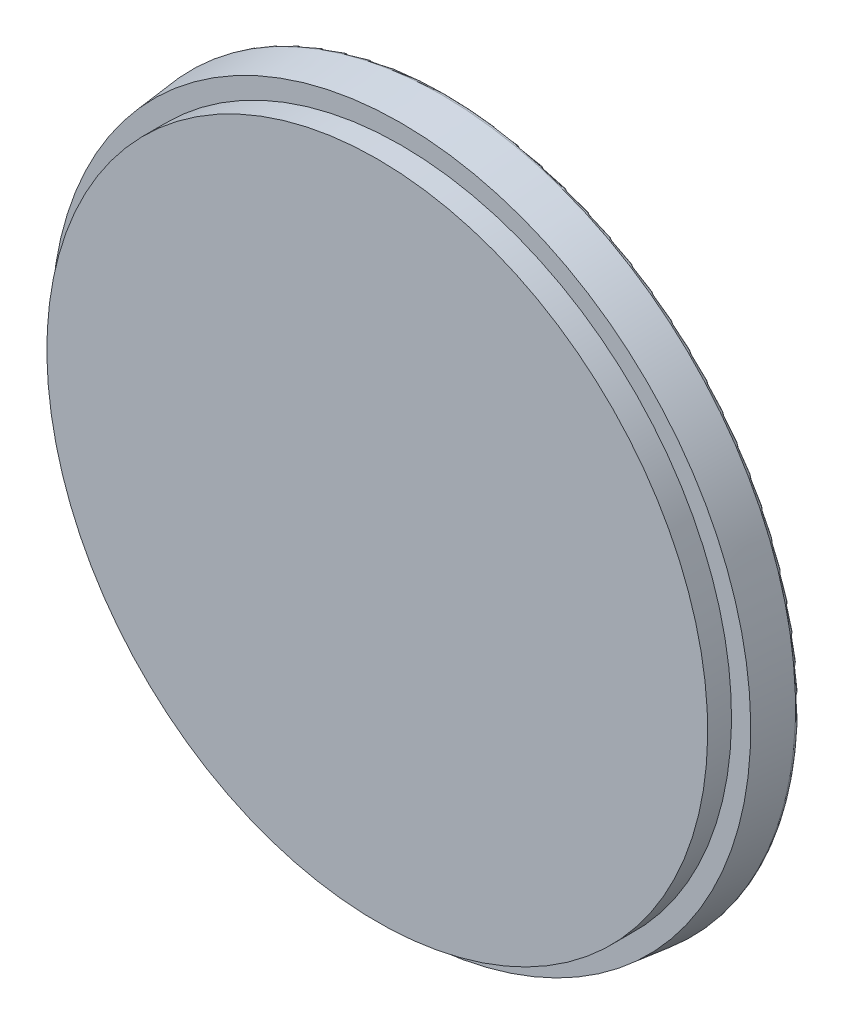
ISO-10303-21;
HEADER;
FILE_DESCRIPTION(('STEP AP214'),'2;1');
FILE_NAME('part.step','',(''),(''),'','','');
FILE_SCHEMA(('AUTOMOTIVE_DESIGN { 1 0 10303 214 1 1 1 1 }'));
ENDSEC;
DATA;
#1=APPLICATION_CONTEXT('core data for automotive mechanical design processes');
#2=APPLICATION_PROTOCOL_DEFINITION('international standard','automotive_design',2000,#1);
#3=PRODUCT_CONTEXT('',#1,'mechanical');
#4=PRODUCT('Part','Part','',(#3));
#5=PRODUCT_RELATED_PRODUCT_CATEGORY('part','',(#4));
#6=PRODUCT_DEFINITION_FORMATION('','',#4);
#7=PRODUCT_DEFINITION_CONTEXT('part definition',#1,'design');
#8=PRODUCT_DEFINITION('design','',#6,#7);
#9=PRODUCT_DEFINITION_SHAPE('','',#8);
#10=(LENGTH_UNIT() NAMED_UNIT(*) SI_UNIT(.MILLI.,.METRE.));
#11=(NAMED_UNIT(*) PLANE_ANGLE_UNIT() SI_UNIT($,.RADIAN.));
#12=(NAMED_UNIT(*) SI_UNIT($,.STERADIAN.) SOLID_ANGLE_UNIT());
#13=UNCERTAINTY_MEASURE_WITH_UNIT(LENGTH_MEASURE(1.E-05),#10,'distance_accuracy_value','');
#14=(GEOMETRIC_REPRESENTATION_CONTEXT(3) GLOBAL_UNCERTAINTY_ASSIGNED_CONTEXT((#13)) GLOBAL_UNIT_ASSIGNED_CONTEXT((#10,
#11,#12)) REPRESENTATION_CONTEXT('',''));
#15=CARTESIAN_POINT('',(0.,0.,0.));
#16=DIRECTION('',(0.,0.,1.));
#17=DIRECTION('',(1.,0.,0.));
#18=AXIS2_PLACEMENT_3D('',#15,#16,#17);
#19=CARTESIAN_POINT('',(0.,0.,1221.));
#20=DIRECTION('',(0.,0.,-1.));
#21=DIRECTION('',(0.,1.,0.));
#22=AXIS2_PLACEMENT_3D('',#19,#20,#21);
#23=CYLINDRICAL_SURFACE('',#22,25.);
#24=CARTESIAN_POINT('',(0.,0.,1221.));
#25=DIRECTION('',(0.,0.,-1.));
#26=DIRECTION('',(0.,1.,0.));
#27=AXIS2_PLACEMENT_3D('',#24,#25,#26);
#28=CIRCLE('',#27,25.);
#29=CARTESIAN_POINT('',(0.,25.,1221.));
#30=VERTEX_POINT('',#29);
#31=EDGE_CURVE('E79',#30,#30,#28,.T.);
#32=ORIENTED_EDGE('',*,*,#31,.T.);
#33=EDGE_LOOP('',(#32));
#34=FACE_BOUND('',#33,.T.);
#35=CARTESIAN_POINT('',(0.,0.,1211.));
#36=DIRECTION('',(0.,0.,-1.));
#37=DIRECTION('',(0.,1.,0.));
#38=AXIS2_PLACEMENT_3D('',#35,#36,#37);
#39=CIRCLE('',#38,25.);
#40=CARTESIAN_POINT('',(0.,25.,1211.));
#41=VERTEX_POINT('',#40);
#42=EDGE_CURVE('E11',#41,#41,#39,.T.);
#43=ORIENTED_EDGE('',*,*,#42,.F.);
#44=EDGE_LOOP('',(#43));
#45=FACE_BOUND('',#44,.T.);
#46=ADVANCED_FACE('F16',(#34,#45),#23,.T.);
#47=CARTESIAN_POINT('',(0.,0.,1211.));
#48=DIRECTION('',(0.,0.,-1.));
#49=DIRECTION('',(0.,-1.,0.));
#50=AXIS2_PLACEMENT_3D('',#47,#48,#49);
#51=PLANE('',#50);
#52=ORIENTED_EDGE('',*,*,#42,.T.);
#53=EDGE_LOOP('',(#52));
#54=FACE_BOUND('',#53,.T.);
#55=ADVANCED_FACE('F96',(#54),#51,.T.);
#56=CARTESIAN_POINT('',(0.,0.,1221.5));
#57=DIRECTION('',(0.,0.,-1.));
#58=DIRECTION('',(0.,1.,0.));
#59=AXIS2_PLACEMENT_3D('',#56,#57,#58);
#60=TOROIDAL_SURFACE('',#59,51.4446937425854,0.5);
#61=CARTESIAN_POINT('',(0.,0.,1221.55226423163));
#62=DIRECTION('',(0.,0.,-1.));
#63=DIRECTION('',(0.,1.,0.));
#64=AXIS2_PLACEMENT_3D('',#61,#62,#63);
#65=CIRCLE('',#64,51.9419546902695);
#66=CARTESIAN_POINT('',(0.,51.9419546902695,1221.55226423163));
#67=VERTEX_POINT('',#66);
#68=EDGE_CURVE('E27',#67,#67,#65,.T.);
#69=ORIENTED_EDGE('',*,*,#68,.T.);
#70=EDGE_LOOP('',(#69));
#71=FACE_BOUND('',#70,.T.);
#72=CARTESIAN_POINT('',(0.,0.,1221.));
#73=DIRECTION('',(0.,0.,-1.));
#74=DIRECTION('',(0.,1.,0.));
#75=AXIS2_PLACEMENT_3D('',#72,#73,#74);
#76=CIRCLE('',#75,51.4446937425854);
#77=CARTESIAN_POINT('',(0.,51.4446937425854,1221.));
#78=VERTEX_POINT('',#77);
#79=EDGE_CURVE('E20',#78,#78,#76,.T.);
#80=ORIENTED_EDGE('',*,*,#79,.F.);
#81=EDGE_LOOP('',(#80));
#82=FACE_BOUND('',#81,.T.);
#83=ADVANCED_FACE('F93',(#71,#82),#60,.T.);
#84=CARTESIAN_POINT('',(0.,0.,1227.5));
#85=DIRECTION('',(0.,0.,-1.));
#86=DIRECTION('',(0.,1.,0.));
#87=AXIS2_PLACEMENT_3D('',#84,#85,#86);
#88=CONICAL_SURFACE('',#87,51.3168224707731,0.104719755);
#89=CARTESIAN_POINT('',(0.,0.,1227.5));
#90=DIRECTION('',(0.,0.,-1.));
#91=DIRECTION('',(0.,1.,0.));
#92=AXIS2_PLACEMENT_3D('',#89,#90,#91);
#93=CIRCLE('',#92,51.3168224707731);
#94=CARTESIAN_POINT('',(0.,51.3168224707731,1227.5));
#95=VERTEX_POINT('',#94);
#96=EDGE_CURVE('E69',#95,#95,#93,.T.);
#97=ORIENTED_EDGE('',*,*,#96,.T.);
#98=EDGE_LOOP('',(#97));
#99=FACE_BOUND('',#98,.T.);
#100=ORIENTED_EDGE('',*,*,#68,.F.);
#101=EDGE_LOOP('',(#100));
#102=FACE_BOUND('',#101,.T.);
#103=ADVANCED_FACE('F95',(#99,#102),#88,.T.);
#104=CARTESIAN_POINT('',(-48.5,0.,1227.5));
#105=DIRECTION('',(0.,0.,-1.));
#106=DIRECTION('',(0.,-1.,0.));
#107=AXIS2_PLACEMENT_3D('',#104,#105,#106);
#108=PLANE('',#107);
#109=CARTESIAN_POINT('',(0.,0.,1227.5));
#110=DIRECTION('',(0.,0.,-1.));
#111=DIRECTION('',(0.,1.,0.));
#112=AXIS2_PLACEMENT_3D('',#109,#110,#111);
#113=CIRCLE('',#112,48.5);
#114=CARTESIAN_POINT('',(0.,48.5,1227.5));
#115=VERTEX_POINT('',#114);
#116=EDGE_CURVE('E64',#115,#115,#113,.T.);
#117=ORIENTED_EDGE('',*,*,#116,.T.);
#118=EDGE_LOOP('',(#117));
#119=FACE_BOUND('',#118,.T.);
#120=ORIENTED_EDGE('',*,*,#96,.F.);
#121=EDGE_LOOP('',(#120));
#122=FACE_BOUND('',#121,.T.);
#123=ADVANCED_FACE('F65',(#119,#122),#108,.F.);
#124=CARTESIAN_POINT('',(0.,0.,1226.13));
#125=DIRECTION('',(0.,0.,-1.));
#126=DIRECTION('',(0.,1.,0.));
#127=AXIS2_PLACEMENT_3D('',#124,#125,#126);
#128=CYLINDRICAL_SURFACE('',#127,48.5);
#129=CARTESIAN_POINT('',(0.,0.,1231.));
#130=DIRECTION('',(0.,0.,-1.));
#131=DIRECTION('',(0.,1.,0.));
#132=AXIS2_PLACEMENT_3D('',#129,#130,#131);
#133=CIRCLE('',#132,48.5);
#134=CARTESIAN_POINT('',(0.,48.5,1231.));
#135=VERTEX_POINT('',#134);
#136=EDGE_CURVE('E58',#135,#135,#133,.T.);
#137=ORIENTED_EDGE('',*,*,#136,.T.);
#138=EDGE_LOOP('',(#137));
#139=FACE_BOUND('',#138,.T.);
#140=ORIENTED_EDGE('',*,*,#116,.F.);
#141=EDGE_LOOP('',(#140));
#142=FACE_BOUND('',#141,.T.);
#143=ADVANCED_FACE('F18',(#139,#142),#128,.T.);
#144=CARTESIAN_POINT('',(-43.75,0.,1231.));
#145=DIRECTION('',(0.,0.,-1.));
#146=DIRECTION('',(0.,-1.,0.));
#147=AXIS2_PLACEMENT_3D('',#144,#145,#146);
#148=PLANE('',#147);
#149=ORIENTED_EDGE('',*,*,#136,.F.);
#150=EDGE_LOOP('',(#149));
#151=FACE_BOUND('',#150,.T.);
#152=ADVANCED_FACE('F116',(#151),#148,.F.);
#153=CARTESIAN_POINT('',(-51.4446937425854,0.,1221.));
#154=DIRECTION('',(0.,0.,1.));
#155=DIRECTION('',(1.,0.,0.));
#156=AXIS2_PLACEMENT_3D('',#153,#154,#155);
#157=PLANE('',#156);
#158=ORIENTED_EDGE('',*,*,#79,.T.);
#159=EDGE_LOOP('',(#158));
#160=FACE_BOUND('',#159,.T.);
#161=ORIENTED_EDGE('',*,*,#31,.F.);
#162=EDGE_LOOP('',(#161));
#163=FACE_BOUND('',#162,.T.);
#164=ADVANCED_FACE('F90',(#160,#163),#157,.F.);
#165=CLOSED_SHELL('',(#46,#55,#83,#103,#123,#143,#152,#164));
#166=MANIFOLD_SOLID_BREP('B1',#165);
#167=ADVANCED_BREP_SHAPE_REPRESENTATION('',(#18,#166),#14);
#168=SHAPE_DEFINITION_REPRESENTATION(#9,#167);
ENDSEC;
END-ISO-10303-21;
